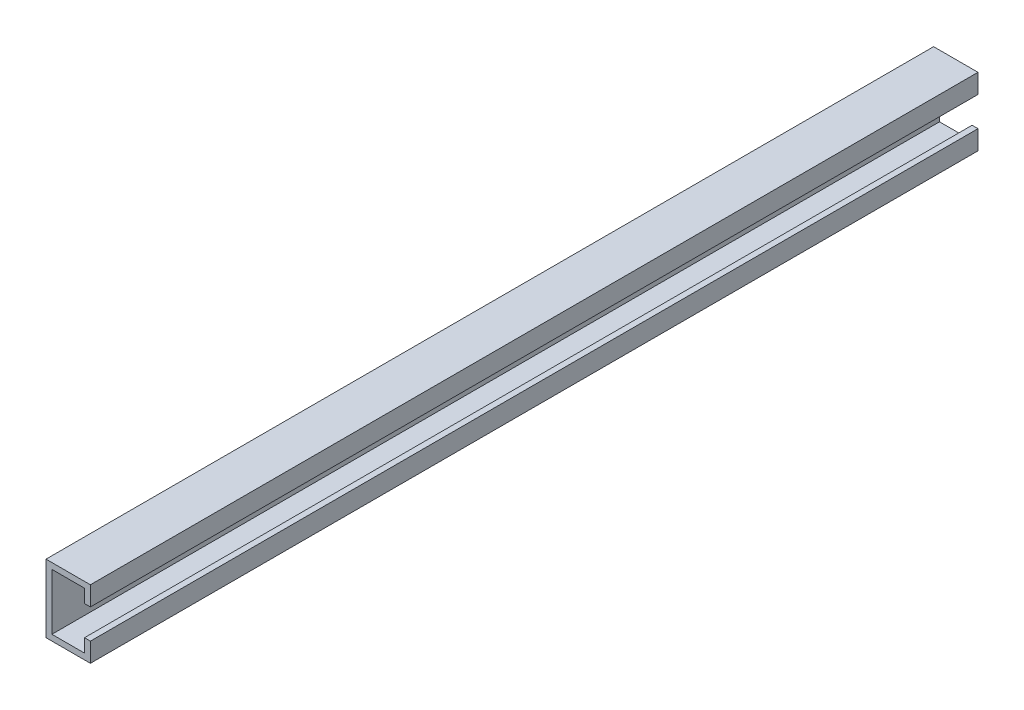
ISO-10303-21;
HEADER;
FILE_DESCRIPTION(('STEP AP214'),'2;1');
FILE_NAME('part.step','',(''),(''),'','','');
FILE_SCHEMA(('AUTOMOTIVE_DESIGN { 1 0 10303 214 1 1 1 1 }'));
ENDSEC;
DATA;
#1=APPLICATION_CONTEXT('core data for automotive mechanical design processes');
#2=APPLICATION_PROTOCOL_DEFINITION('international standard','automotive_design',2000,#1);
#3=PRODUCT_CONTEXT('',#1,'mechanical');
#4=PRODUCT('Part','Part','',(#3));
#5=PRODUCT_RELATED_PRODUCT_CATEGORY('part','',(#4));
#6=PRODUCT_DEFINITION_FORMATION('','',#4);
#7=PRODUCT_DEFINITION_CONTEXT('part definition',#1,'design');
#8=PRODUCT_DEFINITION('design','',#6,#7);
#9=PRODUCT_DEFINITION_SHAPE('','',#8);
#10=(LENGTH_UNIT() NAMED_UNIT(*) SI_UNIT(.MILLI.,.METRE.));
#11=(NAMED_UNIT(*) PLANE_ANGLE_UNIT() SI_UNIT($,.RADIAN.));
#12=(NAMED_UNIT(*) SI_UNIT($,.STERADIAN.) SOLID_ANGLE_UNIT());
#13=UNCERTAINTY_MEASURE_WITH_UNIT(LENGTH_MEASURE(1.E-05),#10,'distance_accuracy_value','');
#14=(GEOMETRIC_REPRESENTATION_CONTEXT(3) GLOBAL_UNCERTAINTY_ASSIGNED_CONTEXT((#13)) GLOBAL_UNIT_ASSIGNED_CONTEXT((#10,
#11,#12)) REPRESENTATION_CONTEXT('',''));
#15=CARTESIAN_POINT('',(0.,0.,0.));
#16=DIRECTION('',(0.,0.,1.));
#17=DIRECTION('',(1.,0.,0.));
#18=AXIS2_PLACEMENT_3D('',#15,#16,#17);
#19=CARTESIAN_POINT('',(0.,-23.,300.));
#20=DIRECTION('',(1.,0.,0.));
#21=DIRECTION('',(0.,0.,-1.));
#22=AXIS2_PLACEMENT_3D('',#19,#20,#21);
#23=PLANE('',#22);
#24=DIRECTION('',(0.,-1.,0.));
#25=VECTOR('',#24,1.);
#26=CARTESIAN_POINT('',(0.,-23.,0.));
#27=LINE('',#26,#25);
#28=CARTESIAN_POINT('',(0.,0.,0.));
#29=VERTEX_POINT('',#28);
#30=CARTESIAN_POINT('',(0.,-23.,0.));
#31=VERTEX_POINT('',#30);
#32=EDGE_CURVE('E164',#29,#31,#27,.T.);
#33=ORIENTED_EDGE('',*,*,#32,.T.);
#34=DIRECTION('',(0.,0.,-1.));
#35=VECTOR('',#34,1.);
#36=CARTESIAN_POINT('',(0.,-23.,300.));
#37=LINE('',#36,#35);
#38=CARTESIAN_POINT('',(0.,-23.,300.));
#39=VERTEX_POINT('',#38);
#40=EDGE_CURVE('E11',#39,#31,#37,.T.);
#41=ORIENTED_EDGE('',*,*,#40,.F.);
#42=DIRECTION('',(0.,-1.,0.));
#43=VECTOR('',#42,1.);
#44=CARTESIAN_POINT('',(0.,-23.,300.));
#45=LINE('',#44,#43);
#46=CARTESIAN_POINT('',(0.,0.,300.));
#47=VERTEX_POINT('',#46);
#48=EDGE_CURVE('E198',#47,#39,#45,.T.);
#49=ORIENTED_EDGE('',*,*,#48,.F.);
#50=DIRECTION('',(0.,0.,-1.));
#51=VECTOR('',#50,1.);
#52=CARTESIAN_POINT('',(0.,0.,300.));
#53=LINE('',#52,#51);
#54=EDGE_CURVE('E160',#47,#29,#53,.T.);
#55=ORIENTED_EDGE('',*,*,#54,.T.);
#56=EDGE_LOOP('',(#33,#41,#49,#55));
#57=FACE_BOUND('',#56,.T.);
#58=ADVANCED_FACE('F39',(#57),#23,.F.);
#59=CARTESIAN_POINT('',(15.,-23.,300.));
#60=DIRECTION('',(0.,1.,0.));
#61=DIRECTION('',(0.,0.,1.));
#62=AXIS2_PLACEMENT_3D('',#59,#60,#61);
#63=PLANE('',#62);
#64=DIRECTION('',(1.,0.,0.));
#65=VECTOR('',#64,1.);
#66=CARTESIAN_POINT('',(15.,-23.,0.));
#67=LINE('',#66,#65);
#68=CARTESIAN_POINT('',(15.,-23.,0.));
#69=VERTEX_POINT('',#68);
#70=EDGE_CURVE('E168',#31,#69,#67,.T.);
#71=ORIENTED_EDGE('',*,*,#70,.T.);
#72=DIRECTION('',(0.,0.,-1.));
#73=VECTOR('',#72,1.);
#74=CARTESIAN_POINT('',(15.,-23.,300.));
#75=LINE('',#74,#73);
#76=CARTESIAN_POINT('',(15.,-23.,300.));
#77=VERTEX_POINT('',#76);
#78=EDGE_CURVE('E48',#77,#69,#75,.T.);
#79=ORIENTED_EDGE('',*,*,#78,.F.);
#80=DIRECTION('',(1.,0.,0.));
#81=VECTOR('',#80,1.);
#82=CARTESIAN_POINT('',(15.,-23.,300.));
#83=LINE('',#82,#81);
#84=EDGE_CURVE('E111',#39,#77,#83,.T.);
#85=ORIENTED_EDGE('',*,*,#84,.F.);
#86=ORIENTED_EDGE('',*,*,#40,.T.);
#87=EDGE_LOOP('',(#71,#79,#85,#86));
#88=FACE_BOUND('',#87,.T.);
#89=ADVANCED_FACE('F292',(#88),#63,.F.);
#90=CARTESIAN_POINT('',(15.,-16.5,300.));
#91=DIRECTION('',(-1.,0.,0.));
#92=DIRECTION('',(0.,0.,1.));
#93=AXIS2_PLACEMENT_3D('',#90,#91,#92);
#94=PLANE('',#93);
#95=DIRECTION('',(0.,1.,0.));
#96=VECTOR('',#95,1.);
#97=CARTESIAN_POINT('',(15.,-16.5,0.));
#98=LINE('',#97,#96);
#99=CARTESIAN_POINT('',(15.,-16.5,0.));
#100=VERTEX_POINT('',#99);
#101=EDGE_CURVE('E171',#69,#100,#98,.T.);
#102=ORIENTED_EDGE('',*,*,#101,.T.);
#103=DIRECTION('',(0.,0.,-1.));
#104=VECTOR('',#103,1.);
#105=CARTESIAN_POINT('',(15.,-16.5,300.));
#106=LINE('',#105,#104);
#107=CARTESIAN_POINT('',(15.,-16.5,300.));
#108=VERTEX_POINT('',#107);
#109=EDGE_CURVE('E225',#108,#100,#106,.T.);
#110=ORIENTED_EDGE('',*,*,#109,.F.);
#111=DIRECTION('',(0.,1.,0.));
#112=VECTOR('',#111,1.);
#113=CARTESIAN_POINT('',(15.,-16.5,300.));
#114=LINE('',#113,#112);
#115=EDGE_CURVE('E235',#77,#108,#114,.T.);
#116=ORIENTED_EDGE('',*,*,#115,.F.);
#117=ORIENTED_EDGE('',*,*,#78,.T.);
#118=EDGE_LOOP('',(#102,#110,#116,#117));
#119=FACE_BOUND('',#118,.T.);
#120=ADVANCED_FACE('F233',(#119),#94,.F.);
#121=CARTESIAN_POINT('',(13.,-16.5,300.));
#122=DIRECTION('',(0.,-1.,0.));
#123=DIRECTION('',(0.,0.,-1.));
#124=AXIS2_PLACEMENT_3D('',#121,#122,#123);
#125=PLANE('',#124);
#126=DIRECTION('',(-1.,0.,0.));
#127=VECTOR('',#126,1.);
#128=CARTESIAN_POINT('',(13.,-16.5,0.));
#129=LINE('',#128,#127);
#130=CARTESIAN_POINT('',(13.,-16.5,0.));
#131=VERTEX_POINT('',#130);
#132=EDGE_CURVE('E174',#100,#131,#129,.T.);
#133=ORIENTED_EDGE('',*,*,#132,.T.);
#134=DIRECTION('',(0.,0.,-1.));
#135=VECTOR('',#134,1.);
#136=CARTESIAN_POINT('',(13.,-16.5,300.));
#137=LINE('',#136,#135);
#138=CARTESIAN_POINT('',(13.,-16.5,300.));
#139=VERTEX_POINT('',#138);
#140=EDGE_CURVE('E221',#139,#131,#137,.T.);
#141=ORIENTED_EDGE('',*,*,#140,.F.);
#142=DIRECTION('',(-1.,0.,0.));
#143=VECTOR('',#142,1.);
#144=CARTESIAN_POINT('',(13.,-16.5,300.));
#145=LINE('',#144,#143);
#146=EDGE_CURVE('E254',#108,#139,#145,.T.);
#147=ORIENTED_EDGE('',*,*,#146,.F.);
#148=ORIENTED_EDGE('',*,*,#109,.T.);
#149=EDGE_LOOP('',(#133,#141,#147,#148));
#150=FACE_BOUND('',#149,.T.);
#151=ADVANCED_FACE('F244',(#150),#125,.F.);
#152=CARTESIAN_POINT('',(13.,-21.,300.));
#153=DIRECTION('',(1.,0.,0.));
#154=DIRECTION('',(0.,0.,-1.));
#155=AXIS2_PLACEMENT_3D('',#152,#153,#154);
#156=PLANE('',#155);
#157=DIRECTION('',(0.,-1.,0.));
#158=VECTOR('',#157,1.);
#159=CARTESIAN_POINT('',(13.,-21.,0.));
#160=LINE('',#159,#158);
#161=CARTESIAN_POINT('',(13.,-21.,0.));
#162=VERTEX_POINT('',#161);
#163=EDGE_CURVE('E177',#131,#162,#160,.T.);
#164=ORIENTED_EDGE('',*,*,#163,.T.);
#165=DIRECTION('',(0.,0.,-1.));
#166=VECTOR('',#165,1.);
#167=CARTESIAN_POINT('',(13.,-21.,300.));
#168=LINE('',#167,#166);
#169=CARTESIAN_POINT('',(13.,-21.,300.));
#170=VERTEX_POINT('',#169);
#171=EDGE_CURVE('E217',#170,#162,#168,.T.);
#172=ORIENTED_EDGE('',*,*,#171,.F.);
#173=DIRECTION('',(0.,-1.,0.));
#174=VECTOR('',#173,1.);
#175=CARTESIAN_POINT('',(13.,-21.,300.));
#176=LINE('',#175,#174);
#177=EDGE_CURVE('E250',#139,#170,#176,.T.);
#178=ORIENTED_EDGE('',*,*,#177,.F.);
#179=ORIENTED_EDGE('',*,*,#140,.T.);
#180=EDGE_LOOP('',(#164,#172,#178,#179));
#181=FACE_BOUND('',#180,.T.);
#182=ADVANCED_FACE('F248',(#181),#156,.F.);
#183=CARTESIAN_POINT('',(2.,-21.,300.));
#184=DIRECTION('',(0.,-1.,0.));
#185=DIRECTION('',(0.,0.,-1.));
#186=AXIS2_PLACEMENT_3D('',#183,#184,#185);
#187=PLANE('',#186);
#188=DIRECTION('',(-1.,0.,0.));
#189=VECTOR('',#188,1.);
#190=CARTESIAN_POINT('',(2.,-21.,0.));
#191=LINE('',#190,#189);
#192=CARTESIAN_POINT('',(2.,-21.,0.));
#193=VERTEX_POINT('',#192);
#194=EDGE_CURVE('E180',#162,#193,#191,.T.);
#195=ORIENTED_EDGE('',*,*,#194,.T.);
#196=DIRECTION('',(0.,0.,-1.));
#197=VECTOR('',#196,1.);
#198=CARTESIAN_POINT('',(2.,-21.,300.));
#199=LINE('',#198,#197);
#200=CARTESIAN_POINT('',(2.,-21.,300.));
#201=VERTEX_POINT('',#200);
#202=EDGE_CURVE('E213',#201,#193,#199,.T.);
#203=ORIENTED_EDGE('',*,*,#202,.F.);
#204=DIRECTION('',(-1.,0.,0.));
#205=VECTOR('',#204,1.);
#206=CARTESIAN_POINT('',(2.,-21.,300.));
#207=LINE('',#206,#205);
#208=EDGE_CURVE('E253',#170,#201,#207,.T.);
#209=ORIENTED_EDGE('',*,*,#208,.F.);
#210=ORIENTED_EDGE('',*,*,#171,.T.);
#211=EDGE_LOOP('',(#195,#203,#209,#210));
#212=FACE_BOUND('',#211,.T.);
#213=ADVANCED_FACE('F305',(#212),#187,.F.);
#214=CARTESIAN_POINT('',(2.,-2.,300.));
#215=DIRECTION('',(-1.,0.,0.));
#216=DIRECTION('',(0.,0.,1.));
#217=AXIS2_PLACEMENT_3D('',#214,#215,#216);
#218=PLANE('',#217);
#219=DIRECTION('',(0.,1.,0.));
#220=VECTOR('',#219,1.);
#221=CARTESIAN_POINT('',(2.,-2.,0.));
#222=LINE('',#221,#220);
#223=CARTESIAN_POINT('',(2.,-2.,0.));
#224=VERTEX_POINT('',#223);
#225=EDGE_CURVE('E183',#193,#224,#222,.T.);
#226=ORIENTED_EDGE('',*,*,#225,.T.);
#227=DIRECTION('',(0.,0.,-1.));
#228=VECTOR('',#227,1.);
#229=CARTESIAN_POINT('',(2.,-2.,300.));
#230=LINE('',#229,#228);
#231=CARTESIAN_POINT('',(2.,-2.,300.));
#232=VERTEX_POINT('',#231);
#233=EDGE_CURVE('E209',#232,#224,#230,.T.);
#234=ORIENTED_EDGE('',*,*,#233,.F.);
#235=DIRECTION('',(0.,1.,0.));
#236=VECTOR('',#235,1.);
#237=CARTESIAN_POINT('',(2.,-2.,300.));
#238=LINE('',#237,#236);
#239=EDGE_CURVE('E258',#201,#232,#238,.T.);
#240=ORIENTED_EDGE('',*,*,#239,.F.);
#241=ORIENTED_EDGE('',*,*,#202,.T.);
#242=EDGE_LOOP('',(#226,#234,#240,#241));
#243=FACE_BOUND('',#242,.T.);
#244=ADVANCED_FACE('F308',(#243),#218,.F.);
#245=CARTESIAN_POINT('',(13.,-2.,300.));
#246=DIRECTION('',(0.,1.,0.));
#247=DIRECTION('',(0.,0.,1.));
#248=AXIS2_PLACEMENT_3D('',#245,#246,#247);
#249=PLANE('',#248);
#250=DIRECTION('',(1.,0.,0.));
#251=VECTOR('',#250,1.);
#252=CARTESIAN_POINT('',(13.,-2.,0.));
#253=LINE('',#252,#251);
#254=CARTESIAN_POINT('',(13.,-2.,0.));
#255=VERTEX_POINT('',#254);
#256=EDGE_CURVE('E186',#224,#255,#253,.T.);
#257=ORIENTED_EDGE('',*,*,#256,.T.);
#258=DIRECTION('',(0.,0.,-1.));
#259=VECTOR('',#258,1.);
#260=CARTESIAN_POINT('',(13.,-2.,300.));
#261=LINE('',#260,#259);
#262=CARTESIAN_POINT('',(13.,-2.,300.));
#263=VERTEX_POINT('',#262);
#264=EDGE_CURVE('E205',#263,#255,#261,.T.);
#265=ORIENTED_EDGE('',*,*,#264,.F.);
#266=DIRECTION('',(1.,0.,0.));
#267=VECTOR('',#266,1.);
#268=CARTESIAN_POINT('',(13.,-2.,300.));
#269=LINE('',#268,#267);
#270=EDGE_CURVE('E265',#232,#263,#269,.T.);
#271=ORIENTED_EDGE('',*,*,#270,.F.);
#272=ORIENTED_EDGE('',*,*,#233,.T.);
#273=EDGE_LOOP('',(#257,#265,#271,#272));
#274=FACE_BOUND('',#273,.T.);
#275=ADVANCED_FACE('F273',(#274),#249,.F.);
#276=CARTESIAN_POINT('',(13.,-6.5,300.));
#277=DIRECTION('',(1.,0.,0.));
#278=DIRECTION('',(0.,0.,-1.));
#279=AXIS2_PLACEMENT_3D('',#276,#277,#278);
#280=PLANE('',#279);
#281=DIRECTION('',(0.,-1.,0.));
#282=VECTOR('',#281,1.);
#283=CARTESIAN_POINT('',(13.,-6.5,0.));
#284=LINE('',#283,#282);
#285=CARTESIAN_POINT('',(13.,-6.5,0.));
#286=VERTEX_POINT('',#285);
#287=EDGE_CURVE('E189',#255,#286,#284,.T.);
#288=ORIENTED_EDGE('',*,*,#287,.T.);
#289=DIRECTION('',(0.,0.,-1.));
#290=VECTOR('',#289,1.);
#291=CARTESIAN_POINT('',(13.,-6.5,300.));
#292=LINE('',#291,#290);
#293=CARTESIAN_POINT('',(13.,-6.5,300.));
#294=VERTEX_POINT('',#293);
#295=EDGE_CURVE('E153',#294,#286,#292,.T.);
#296=ORIENTED_EDGE('',*,*,#295,.F.);
#297=DIRECTION('',(0.,-1.,0.));
#298=VECTOR('',#297,1.);
#299=CARTESIAN_POINT('',(13.,-6.5,300.));
#300=LINE('',#299,#298);
#301=EDGE_CURVE('E142',#263,#294,#300,.T.);
#302=ORIENTED_EDGE('',*,*,#301,.F.);
#303=ORIENTED_EDGE('',*,*,#264,.T.);
#304=EDGE_LOOP('',(#288,#296,#302,#303));
#305=FACE_BOUND('',#304,.T.);
#306=ADVANCED_FACE('F277',(#305),#280,.F.);
#307=CARTESIAN_POINT('',(15.,-6.5,300.));
#308=DIRECTION('',(0.,1.,0.));
#309=DIRECTION('',(0.,0.,1.));
#310=AXIS2_PLACEMENT_3D('',#307,#308,#309);
#311=PLANE('',#310);
#312=DIRECTION('',(1.,0.,0.));
#313=VECTOR('',#312,1.);
#314=CARTESIAN_POINT('',(15.,-6.5,0.));
#315=LINE('',#314,#313);
#316=CARTESIAN_POINT('',(15.,-6.5,0.));
#317=VERTEX_POINT('',#316);
#318=EDGE_CURVE('E151',#286,#317,#315,.T.);
#319=ORIENTED_EDGE('',*,*,#318,.T.);
#320=DIRECTION('',(0.,0.,-1.));
#321=VECTOR('',#320,1.);
#322=CARTESIAN_POINT('',(15.,-6.5,300.));
#323=LINE('',#322,#321);
#324=CARTESIAN_POINT('',(15.,-6.5,300.));
#325=VERTEX_POINT('',#324);
#326=EDGE_CURVE('E148',#325,#317,#323,.T.);
#327=ORIENTED_EDGE('',*,*,#326,.F.);
#328=DIRECTION('',(1.,0.,0.));
#329=VECTOR('',#328,1.);
#330=CARTESIAN_POINT('',(15.,-6.5,300.));
#331=LINE('',#330,#329);
#332=EDGE_CURVE('E136',#294,#325,#331,.T.);
#333=ORIENTED_EDGE('',*,*,#332,.F.);
#334=ORIENTED_EDGE('',*,*,#295,.T.);
#335=EDGE_LOOP('',(#319,#327,#333,#334));
#336=FACE_BOUND('',#335,.T.);
#337=ADVANCED_FACE('F149',(#336),#311,.F.);
#338=CARTESIAN_POINT('',(15.,0.,300.));
#339=DIRECTION('',(-1.,0.,0.));
#340=DIRECTION('',(0.,0.,1.));
#341=AXIS2_PLACEMENT_3D('',#338,#339,#340);
#342=PLANE('',#341);
#343=DIRECTION('',(0.,1.,0.));
#344=VECTOR('',#343,1.);
#345=CARTESIAN_POINT('',(15.,0.,0.));
#346=LINE('',#345,#344);
#347=CARTESIAN_POINT('',(15.,0.,0.));
#348=VERTEX_POINT('',#347);
#349=EDGE_CURVE('E97',#317,#348,#346,.T.);
#350=ORIENTED_EDGE('',*,*,#349,.T.);
#351=DIRECTION('',(0.,0.,-1.));
#352=VECTOR('',#351,1.);
#353=CARTESIAN_POINT('',(15.,0.,300.));
#354=LINE('',#353,#352);
#355=CARTESIAN_POINT('',(15.,0.,300.));
#356=VERTEX_POINT('',#355);
#357=EDGE_CURVE('E154',#356,#348,#354,.T.);
#358=ORIENTED_EDGE('',*,*,#357,.F.);
#359=DIRECTION('',(0.,1.,0.));
#360=VECTOR('',#359,1.);
#361=CARTESIAN_POINT('',(15.,0.,300.));
#362=LINE('',#361,#360);
#363=EDGE_CURVE('E140',#325,#356,#362,.T.);
#364=ORIENTED_EDGE('',*,*,#363,.F.);
#365=ORIENTED_EDGE('',*,*,#326,.T.);
#366=EDGE_LOOP('',(#350,#358,#364,#365));
#367=FACE_BOUND('',#366,.T.);
#368=ADVANCED_FACE('F156',(#367),#342,.F.);
#369=CARTESIAN_POINT('',(0.,0.,300.));
#370=DIRECTION('',(0.,-1.,0.));
#371=DIRECTION('',(0.,0.,-1.));
#372=AXIS2_PLACEMENT_3D('',#369,#370,#371);
#373=PLANE('',#372);
#374=DIRECTION('',(-1.,0.,0.));
#375=VECTOR('',#374,1.);
#376=CARTESIAN_POINT('',(0.,0.,0.));
#377=LINE('',#376,#375);
#378=EDGE_CURVE('E103',#348,#29,#377,.T.);
#379=ORIENTED_EDGE('',*,*,#378,.T.);
#380=ORIENTED_EDGE('',*,*,#54,.F.);
#381=DIRECTION('',(-1.,0.,0.));
#382=VECTOR('',#381,1.);
#383=CARTESIAN_POINT('',(0.,0.,300.));
#384=LINE('',#383,#382);
#385=EDGE_CURVE('E56',#356,#47,#384,.T.);
#386=ORIENTED_EDGE('',*,*,#385,.F.);
#387=ORIENTED_EDGE('',*,*,#357,.T.);
#388=EDGE_LOOP('',(#379,#380,#386,#387));
#389=FACE_BOUND('',#388,.T.);
#390=ADVANCED_FACE('F281',(#389),#373,.F.);
#391=CARTESIAN_POINT('',(0.,0.,300.));
#392=DIRECTION('',(0.,0.,-1.));
#393=DIRECTION('',(-1.,0.,0.));
#394=AXIS2_PLACEMENT_3D('',#391,#392,#393);
#395=PLANE('',#394);
#396=ORIENTED_EDGE('',*,*,#48,.T.);
#397=ORIENTED_EDGE('',*,*,#84,.T.);
#398=ORIENTED_EDGE('',*,*,#115,.T.);
#399=ORIENTED_EDGE('',*,*,#146,.T.);
#400=ORIENTED_EDGE('',*,*,#177,.T.);
#401=ORIENTED_EDGE('',*,*,#208,.T.);
#402=ORIENTED_EDGE('',*,*,#239,.T.);
#403=ORIENTED_EDGE('',*,*,#270,.T.);
#404=ORIENTED_EDGE('',*,*,#301,.T.);
#405=ORIENTED_EDGE('',*,*,#332,.T.);
#406=ORIENTED_EDGE('',*,*,#363,.T.);
#407=ORIENTED_EDGE('',*,*,#385,.T.);
#408=EDGE_LOOP('',(#396,#397,#398,#399,#400,#401,#402,#403,#404,#405,#406,#407));
#409=FACE_BOUND('',#408,.T.);
#410=ADVANCED_FACE('F138',(#409),#395,.F.);
#411=CARTESIAN_POINT('',(0.,0.,0.));
#412=DIRECTION('',(0.,0.,-1.));
#413=DIRECTION('',(-1.,0.,0.));
#414=AXIS2_PLACEMENT_3D('',#411,#412,#413);
#415=PLANE('',#414);
#416=ORIENTED_EDGE('',*,*,#32,.F.);
#417=ORIENTED_EDGE('',*,*,#378,.F.);
#418=ORIENTED_EDGE('',*,*,#349,.F.);
#419=ORIENTED_EDGE('',*,*,#318,.F.);
#420=ORIENTED_EDGE('',*,*,#287,.F.);
#421=ORIENTED_EDGE('',*,*,#256,.F.);
#422=ORIENTED_EDGE('',*,*,#225,.F.);
#423=ORIENTED_EDGE('',*,*,#194,.F.);
#424=ORIENTED_EDGE('',*,*,#163,.F.);
#425=ORIENTED_EDGE('',*,*,#132,.F.);
#426=ORIENTED_EDGE('',*,*,#101,.F.);
#427=ORIENTED_EDGE('',*,*,#70,.F.);
#428=EDGE_LOOP('',(#416,#417,#418,#419,#420,#421,#422,#423,#424,#425,#426,#427));
#429=FACE_BOUND('',#428,.T.);
#430=ADVANCED_FACE('F239',(#429),#415,.T.);
#431=CLOSED_SHELL('',(#58,#89,#120,#151,#182,#213,#244,#275,#306,#337,#368,#390,#410,#430));
#432=MANIFOLD_SOLID_BREP('B2',#431);
#433=ADVANCED_BREP_SHAPE_REPRESENTATION('',(#18,#432),#14);
#434=SHAPE_DEFINITION_REPRESENTATION(#9,#433);
ENDSEC;
END-ISO-10303-21;
